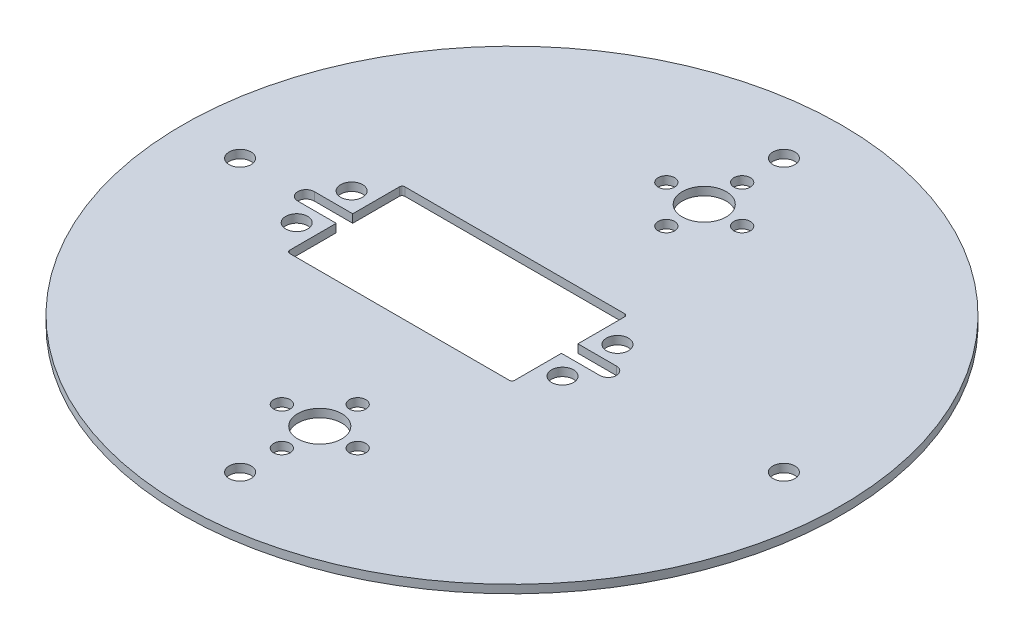
ISO-10303-21;
HEADER;
FILE_DESCRIPTION(('STEP AP214'),'2;1');
FILE_NAME('part.step','',(''),(''),'','','');
FILE_SCHEMA(('AUTOMOTIVE_DESIGN { 1 0 10303 214 1 1 1 1 }'));
ENDSEC;
DATA;
#1=APPLICATION_CONTEXT('core data for automotive mechanical design processes');
#2=APPLICATION_PROTOCOL_DEFINITION('international standard','automotive_design',2000,#1);
#3=PRODUCT_CONTEXT('',#1,'mechanical');
#4=PRODUCT('Part','Part','',(#3));
#5=PRODUCT_RELATED_PRODUCT_CATEGORY('part','',(#4));
#6=PRODUCT_DEFINITION_FORMATION('','',#4);
#7=PRODUCT_DEFINITION_CONTEXT('part definition',#1,'design');
#8=PRODUCT_DEFINITION('design','',#6,#7);
#9=PRODUCT_DEFINITION_SHAPE('','',#8);
#10=(LENGTH_UNIT() NAMED_UNIT(*) SI_UNIT(.MILLI.,.METRE.));
#11=(NAMED_UNIT(*) PLANE_ANGLE_UNIT() SI_UNIT($,.RADIAN.));
#12=(NAMED_UNIT(*) SI_UNIT($,.STERADIAN.) SOLID_ANGLE_UNIT());
#13=UNCERTAINTY_MEASURE_WITH_UNIT(LENGTH_MEASURE(1.E-05),#10,'distance_accuracy_value','');
#14=(GEOMETRIC_REPRESENTATION_CONTEXT(3) GLOBAL_UNCERTAINTY_ASSIGNED_CONTEXT((#13)) GLOBAL_UNIT_ASSIGNED_CONTEXT((#10,
#11,#12)) REPRESENTATION_CONTEXT('',''));
#15=CARTESIAN_POINT('',(0.,0.,0.));
#16=DIRECTION('',(0.,0.,1.));
#17=DIRECTION('',(1.,0.,0.));
#18=AXIS2_PLACEMENT_3D('',#15,#16,#17);
#19=CARTESIAN_POINT('',(0.,1.5,0.));
#20=DIRECTION('',(0.,1.,0.));
#21=DIRECTION('',(0.,0.,1.));
#22=AXIS2_PLACEMENT_3D('',#19,#20,#21);
#23=PLANE('',#22);
#24=CARTESIAN_POINT('',(14.2,1.5,-5.00000000000001));
#25=DIRECTION('',(0.,1.,0.));
#26=DIRECTION('',(0.,0.,-1.));
#27=AXIS2_PLACEMENT_3D('',#24,#25,#26);
#28=CIRCLE('',#27,2.);
#29=CARTESIAN_POINT('',(14.2,1.5,-7.00000000000001));
#30=VERTEX_POINT('',#29);
#31=EDGE_CURVE('E473',#30,#30,#28,.T.);
#32=ORIENTED_EDGE('',*,*,#31,.F.);
#33=EDGE_LOOP('',(#32));
#34=FACE_BOUND('',#33,.T.);
#35=CARTESIAN_POINT('',(-34.2,1.5,-5.));
#36=DIRECTION('',(0.,1.,0.));
#37=DIRECTION('',(0.,0.,1.));
#38=AXIS2_PLACEMENT_3D('',#35,#36,#37);
#39=CIRCLE('',#38,2.);
#40=CARTESIAN_POINT('',(-34.2,1.5,-3.));
#41=VERTEX_POINT('',#40);
#42=EDGE_CURVE('E235',#41,#41,#39,.T.);
#43=ORIENTED_EDGE('',*,*,#42,.F.);
#44=EDGE_LOOP('',(#43));
#45=FACE_BOUND('',#44,.T.);
#46=CARTESIAN_POINT('',(0.,1.5,41.9));
#47=DIRECTION('',(0.,1.,0.));
#48=DIRECTION('',(0.,0.,-1.));
#49=AXIS2_PLACEMENT_3D('',#46,#47,#48);
#50=CIRCLE('',#49,1.5);
#51=CARTESIAN_POINT('',(0.,1.5,40.4));
#52=VERTEX_POINT('',#51);
#53=EDGE_CURVE('E343',#52,#52,#50,.T.);
#54=ORIENTED_EDGE('',*,*,#53,.F.);
#55=EDGE_LOOP('',(#54));
#56=FACE_BOUND('',#55,.T.);
#57=CARTESIAN_POINT('',(1.45918931843151E-13,1.5,28.1));
#58=DIRECTION('',(0.,1.,0.));
#59=DIRECTION('',(0.,0.,-1.));
#60=AXIS2_PLACEMENT_3D('',#57,#58,#59);
#61=CIRCLE('',#60,1.5);
#62=CARTESIAN_POINT('',(1.45918931843151E-13,1.5,26.6));
#63=VERTEX_POINT('',#62);
#64=EDGE_CURVE('E359',#63,#63,#61,.T.);
#65=ORIENTED_EDGE('',*,*,#64,.F.);
#66=EDGE_LOOP('',(#65));
#67=FACE_BOUND('',#66,.T.);
#68=CARTESIAN_POINT('',(1.45918931843151E-13,1.5,-28.1));
#69=DIRECTION('',(0.,1.,0.));
#70=DIRECTION('',(0.,0.,1.));
#71=AXIS2_PLACEMENT_3D('',#68,#69,#70);
#72=CIRCLE('',#71,1.5);
#73=CARTESIAN_POINT('',(1.45918931843151E-13,1.5,-26.6));
#74=VERTEX_POINT('',#73);
#75=EDGE_CURVE('E375',#74,#74,#72,.T.);
#76=ORIENTED_EDGE('',*,*,#75,.F.);
#77=EDGE_LOOP('',(#76));
#78=FACE_BOUND('',#77,.T.);
#79=CARTESIAN_POINT('',(0.,1.5,35.));
#80=DIRECTION('',(0.,1.,0.));
#81=DIRECTION('',(0.,0.,-1.));
#82=AXIS2_PLACEMENT_3D('',#79,#80,#81);
#83=CIRCLE('',#82,4.);
#84=CARTESIAN_POINT('',(0.,1.5,31.));
#85=VERTEX_POINT('',#84);
#86=EDGE_CURVE('E391',#85,#85,#83,.T.);
#87=ORIENTED_EDGE('',*,*,#86,.F.);
#88=EDGE_LOOP('',(#87));
#89=FACE_BOUND('',#88,.T.);
#90=CARTESIAN_POINT('',(0.,1.5,-35.));
#91=DIRECTION('',(0.,1.,0.));
#92=DIRECTION('',(0.,0.,1.));
#93=AXIS2_PLACEMENT_3D('',#90,#91,#92);
#94=CIRCLE('',#93,4.);
#95=CARTESIAN_POINT('',(0.,1.5,-31.));
#96=VERTEX_POINT('',#95);
#97=EDGE_CURVE('E407',#96,#96,#94,.T.);
#98=ORIENTED_EDGE('',*,*,#97,.F.);
#99=EDGE_LOOP('',(#98));
#100=FACE_BOUND('',#99,.T.);
#101=CARTESIAN_POINT('',(0.,1.5,49.5));
#102=DIRECTION('',(0.,1.,0.));
#103=DIRECTION('',(0.,0.,1.));
#104=AXIS2_PLACEMENT_3D('',#101,#102,#103);
#105=CIRCLE('',#104,2.);
#106=CARTESIAN_POINT('',(0.,1.5,51.5));
#107=VERTEX_POINT('',#106);
#108=EDGE_CURVE('E423',#107,#107,#105,.T.);
#109=ORIENTED_EDGE('',*,*,#108,.F.);
#110=EDGE_LOOP('',(#109));
#111=FACE_BOUND('',#110,.T.);
#112=CARTESIAN_POINT('',(0.,1.5,-49.5));
#113=DIRECTION('',(0.,1.,0.));
#114=DIRECTION('',(0.,0.,1.));
#115=AXIS2_PLACEMENT_3D('',#112,#113,#114);
#116=CIRCLE('',#115,2.);
#117=CARTESIAN_POINT('',(0.,1.5,-47.5));
#118=VERTEX_POINT('',#117);
#119=EDGE_CURVE('E439',#118,#118,#116,.T.);
#120=ORIENTED_EDGE('',*,*,#119,.F.);
#121=EDGE_LOOP('',(#120));
#122=FACE_BOUND('',#121,.T.);
#123=CARTESIAN_POINT('',(0.,1.5,0.));
#124=DIRECTION('',(0.,1.,0.));
#125=DIRECTION('',(0.,0.,1.));
#126=AXIS2_PLACEMENT_3D('',#123,#124,#125);
#127=CIRCLE('',#126,60.);
#128=CARTESIAN_POINT('',(0.,1.5,60.));
#129=VERTEX_POINT('',#128);
#130=EDGE_CURVE('E11',#129,#129,#127,.T.);
#131=ORIENTED_EDGE('',*,*,#130,.T.);
#132=EDGE_LOOP('',(#131));
#133=FACE_BOUND('',#132,.T.);
#134=CARTESIAN_POINT('',(-49.5,1.5,0.));
#135=DIRECTION('',(0.,1.,0.));
#136=DIRECTION('',(0.,0.,1.));
#137=AXIS2_PLACEMENT_3D('',#134,#135,#136);
#138=CIRCLE('',#137,2.);
#139=CARTESIAN_POINT('',(-49.5,1.5,2.));
#140=VERTEX_POINT('',#139);
#141=EDGE_CURVE('E431',#140,#140,#138,.T.);
#142=ORIENTED_EDGE('',*,*,#141,.F.);
#143=EDGE_LOOP('',(#142));
#144=FACE_BOUND('',#143,.T.);
#145=CARTESIAN_POINT('',(49.5,1.5,0.));
#146=DIRECTION('',(0.,1.,0.));
#147=DIRECTION('',(0.,0.,1.));
#148=AXIS2_PLACEMENT_3D('',#145,#146,#147);
#149=CIRCLE('',#148,2.);
#150=CARTESIAN_POINT('',(49.5,1.5,2.));
#151=VERTEX_POINT('',#150);
#152=EDGE_CURVE('E415',#151,#151,#149,.T.);
#153=ORIENTED_EDGE('',*,*,#152,.F.);
#154=EDGE_LOOP('',(#153));
#155=FACE_BOUND('',#154,.T.);
#156=CARTESIAN_POINT('',(0.,1.5,-41.9));
#157=DIRECTION('',(0.,1.,0.));
#158=DIRECTION('',(0.,0.,1.));
#159=AXIS2_PLACEMENT_3D('',#156,#157,#158);
#160=CIRCLE('',#159,1.5);
#161=CARTESIAN_POINT('',(0.,1.5,-40.4));
#162=VERTEX_POINT('',#161);
#163=EDGE_CURVE('E399',#162,#162,#160,.T.);
#164=ORIENTED_EDGE('',*,*,#163,.F.);
#165=EDGE_LOOP('',(#164));
#166=FACE_BOUND('',#165,.T.);
#167=CARTESIAN_POINT('',(6.9000000000001,1.5,-35.0000000000001));
#168=DIRECTION('',(0.,1.,0.));
#169=DIRECTION('',(0.,0.,1.));
#170=AXIS2_PLACEMENT_3D('',#167,#168,#169);
#171=CIRCLE('',#170,1.5);
#172=CARTESIAN_POINT('',(6.9000000000001,1.5,-33.5000000000001));
#173=VERTEX_POINT('',#172);
#174=EDGE_CURVE('E383',#173,#173,#171,.T.);
#175=ORIENTED_EDGE('',*,*,#174,.F.);
#176=EDGE_LOOP('',(#175));
#177=FACE_BOUND('',#176,.T.);
#178=CARTESIAN_POINT('',(-6.89999999999991,1.5,-35.));
#179=DIRECTION('',(0.,1.,0.));
#180=DIRECTION('',(0.,0.,1.));
#181=AXIS2_PLACEMENT_3D('',#178,#179,#180);
#182=CIRCLE('',#181,1.50000000000001);
#183=CARTESIAN_POINT('',(-6.89999999999991,1.5,-33.5));
#184=VERTEX_POINT('',#183);
#185=EDGE_CURVE('E367',#184,#184,#182,.T.);
#186=ORIENTED_EDGE('',*,*,#185,.F.);
#187=EDGE_LOOP('',(#186));
#188=FACE_BOUND('',#187,.T.);
#189=CARTESIAN_POINT('',(-6.89999999999991,1.5,35.));
#190=DIRECTION('',(0.,1.,0.));
#191=DIRECTION('',(0.,0.,-1.));
#192=AXIS2_PLACEMENT_3D('',#189,#190,#191);
#193=CIRCLE('',#192,1.50000000000001);
#194=CARTESIAN_POINT('',(-6.89999999999991,1.5,33.5));
#195=VERTEX_POINT('',#194);
#196=EDGE_CURVE('E351',#195,#195,#193,.T.);
#197=ORIENTED_EDGE('',*,*,#196,.F.);
#198=EDGE_LOOP('',(#197));
#199=FACE_BOUND('',#198,.T.);
#200=CARTESIAN_POINT('',(6.9000000000001,1.5,35.0000000000001));
#201=DIRECTION('',(0.,1.,0.));
#202=DIRECTION('',(0.,0.,-1.));
#203=AXIS2_PLACEMENT_3D('',#200,#201,#202);
#204=CIRCLE('',#203,1.5);
#205=CARTESIAN_POINT('',(6.9000000000001,1.5,33.5000000000001));
#206=VERTEX_POINT('',#205);
#207=EDGE_CURVE('E335',#206,#206,#204,.T.);
#208=ORIENTED_EDGE('',*,*,#207,.F.);
#209=EDGE_LOOP('',(#208));
#210=FACE_BOUND('',#209,.T.);
#211=DIRECTION('',(1.,0.,0.));
#212=VECTOR('',#211,1.);
#213=CARTESIAN_POINT('',(-37.5,1.5,1.5));
#214=LINE('',#213,#212);
#215=CARTESIAN_POINT('',(-37.5,1.5,1.5));
#216=VERTEX_POINT('',#215);
#217=CARTESIAN_POINT('',(-30.5,1.5,1.5));
#218=VERTEX_POINT('',#217);
#219=EDGE_CURVE('E172',#216,#218,#214,.T.);
#220=ORIENTED_EDGE('',*,*,#219,.F.);
#221=CARTESIAN_POINT('',(-37.5,1.5,0.));
#222=DIRECTION('',(0.,1.,0.));
#223=DIRECTION('',(0.,0.,1.));
#224=AXIS2_PLACEMENT_3D('',#221,#222,#223);
#225=CIRCLE('',#224,1.5);
#226=CARTESIAN_POINT('',(-37.5,1.5,-1.5));
#227=VERTEX_POINT('',#226);
#228=EDGE_CURVE('E163',#227,#216,#225,.T.);
#229=ORIENTED_EDGE('',*,*,#228,.F.);
#230=DIRECTION('',(-1.,0.,0.));
#231=VECTOR('',#230,1.);
#232=CARTESIAN_POINT('',(-37.5,1.5,-1.5));
#233=LINE('',#232,#231);
#234=CARTESIAN_POINT('',(-30.5,1.5,-1.5));
#235=VERTEX_POINT('',#234);
#236=EDGE_CURVE('E230',#235,#227,#233,.T.);
#237=ORIENTED_EDGE('',*,*,#236,.F.);
#238=DIRECTION('',(0.,0.,1.));
#239=VECTOR('',#238,1.);
#240=CARTESIAN_POINT('',(-30.5,1.5,-1.5));
#241=LINE('',#240,#239);
#242=CARTESIAN_POINT('',(-30.5,1.5,-10.));
#243=VERTEX_POINT('',#242);
#244=EDGE_CURVE('E227',#243,#235,#241,.T.);
#245=ORIENTED_EDGE('',*,*,#244,.F.);
#246=CARTESIAN_POINT('',(-30.,1.5,-10.));
#247=DIRECTION('',(0.,1.,0.));
#248=DIRECTION('',(0.,0.,-1.));
#249=AXIS2_PLACEMENT_3D('',#246,#247,#248);
#250=CIRCLE('',#249,0.5);
#251=CARTESIAN_POINT('',(-30.,1.5,-10.5));
#252=VERTEX_POINT('',#251);
#253=EDGE_CURVE('E224',#252,#243,#250,.T.);
#254=ORIENTED_EDGE('',*,*,#253,.F.);
#255=DIRECTION('',(-1.,0.,0.));
#256=VECTOR('',#255,1.);
#257=CARTESIAN_POINT('',(-30.,1.5,-10.5));
#258=LINE('',#257,#256);
#259=CARTESIAN_POINT('',(10.,1.5,-10.5));
#260=VERTEX_POINT('',#259);
#261=EDGE_CURVE('E221',#260,#252,#258,.T.);
#262=ORIENTED_EDGE('',*,*,#261,.F.);
#263=CARTESIAN_POINT('',(10.,1.5,-10.));
#264=DIRECTION('',(0.,1.,0.));
#265=DIRECTION('',(0.,0.,-1.));
#266=AXIS2_PLACEMENT_3D('',#263,#264,#265);
#267=CIRCLE('',#266,0.5);
#268=CARTESIAN_POINT('',(10.5,1.5,-10.));
#269=VERTEX_POINT('',#268);
#270=EDGE_CURVE('E218',#269,#260,#267,.T.);
#271=ORIENTED_EDGE('',*,*,#270,.F.);
#272=DIRECTION('',(0.,0.,-1.));
#273=VECTOR('',#272,1.);
#274=CARTESIAN_POINT('',(10.5,1.5,-10.));
#275=LINE('',#274,#273);
#276=CARTESIAN_POINT('',(10.5,1.5,-1.5));
#277=VERTEX_POINT('',#276);
#278=EDGE_CURVE('E215',#277,#269,#275,.T.);
#279=ORIENTED_EDGE('',*,*,#278,.F.);
#280=DIRECTION('',(-1.,0.,0.));
#281=VECTOR('',#280,1.);
#282=CARTESIAN_POINT('',(10.5,1.5,-1.5));
#283=LINE('',#282,#281);
#284=CARTESIAN_POINT('',(17.5,1.5,-1.5));
#285=VERTEX_POINT('',#284);
#286=EDGE_CURVE('E212',#285,#277,#283,.T.);
#287=ORIENTED_EDGE('',*,*,#286,.F.);
#288=CARTESIAN_POINT('',(17.5,1.5,0.));
#289=DIRECTION('',(0.,1.,0.));
#290=DIRECTION('',(0.,0.,1.));
#291=AXIS2_PLACEMENT_3D('',#288,#289,#290);
#292=CIRCLE('',#291,1.5);
#293=CARTESIAN_POINT('',(17.5,1.5,1.5));
#294=VERTEX_POINT('',#293);
#295=EDGE_CURVE('E209',#294,#285,#292,.T.);
#296=ORIENTED_EDGE('',*,*,#295,.F.);
#297=DIRECTION('',(1.,0.,0.));
#298=VECTOR('',#297,1.);
#299=CARTESIAN_POINT('',(17.5,1.5,1.5));
#300=LINE('',#299,#298);
#301=CARTESIAN_POINT('',(10.5,1.5,1.5));
#302=VERTEX_POINT('',#301);
#303=EDGE_CURVE('E206',#302,#294,#300,.T.);
#304=ORIENTED_EDGE('',*,*,#303,.F.);
#305=DIRECTION('',(0.,0.,-1.));
#306=VECTOR('',#305,1.);
#307=CARTESIAN_POINT('',(10.5,1.5,1.5));
#308=LINE('',#307,#306);
#309=CARTESIAN_POINT('',(10.5,1.5,9.99999999999999));
#310=VERTEX_POINT('',#309);
#311=EDGE_CURVE('E203',#310,#302,#308,.T.);
#312=ORIENTED_EDGE('',*,*,#311,.F.);
#313=CARTESIAN_POINT('',(10.,1.5,10.));
#314=DIRECTION('',(0.,1.,0.));
#315=DIRECTION('',(0.,0.,-1.));
#316=AXIS2_PLACEMENT_3D('',#313,#314,#315);
#317=CIRCLE('',#316,0.5);
#318=CARTESIAN_POINT('',(10.,1.5,10.5));
#319=VERTEX_POINT('',#318);
#320=EDGE_CURVE('E200',#319,#310,#317,.T.);
#321=ORIENTED_EDGE('',*,*,#320,.F.);
#322=DIRECTION('',(1.,0.,0.));
#323=VECTOR('',#322,1.);
#324=CARTESIAN_POINT('',(10.,1.5,10.5));
#325=LINE('',#324,#323);
#326=CARTESIAN_POINT('',(-30.,1.5,10.5));
#327=VERTEX_POINT('',#326);
#328=EDGE_CURVE('E197',#327,#319,#325,.T.);
#329=ORIENTED_EDGE('',*,*,#328,.F.);
#330=CARTESIAN_POINT('',(-30.,1.5,9.99999999999999));
#331=DIRECTION('',(0.,1.,0.));
#332=DIRECTION('',(0.,0.,-1.));
#333=AXIS2_PLACEMENT_3D('',#330,#331,#332);
#334=CIRCLE('',#333,0.5);
#335=CARTESIAN_POINT('',(-30.5,1.5,9.99999999999999));
#336=VERTEX_POINT('',#335);
#337=EDGE_CURVE('E191',#336,#327,#334,.T.);
#338=ORIENTED_EDGE('',*,*,#337,.F.);
#339=DIRECTION('',(0.,0.,1.));
#340=VECTOR('',#339,1.);
#341=CARTESIAN_POINT('',(-30.5,1.5,9.99999999999999));
#342=LINE('',#341,#340);
#343=EDGE_CURVE('E187',#218,#336,#342,.T.);
#344=ORIENTED_EDGE('',*,*,#343,.F.);
#345=EDGE_LOOP('',(#220,#229,#237,#245,#254,#262,#271,#279,#287,#296,#304,#312,#321,#329,#338,#344));
#346=FACE_BOUND('',#345,.T.);
#347=CARTESIAN_POINT('',(-34.2,1.5,5.));
#348=DIRECTION('',(0.,1.,0.));
#349=DIRECTION('',(0.,0.,-1.));
#350=AXIS2_PLACEMENT_3D('',#347,#348,#349);
#351=CIRCLE('',#350,2.);
#352=CARTESIAN_POINT('',(-34.2,1.5,3.));
#353=VERTEX_POINT('',#352);
#354=EDGE_CURVE('E680',#353,#353,#351,.T.);
#355=ORIENTED_EDGE('',*,*,#354,.F.);
#356=EDGE_LOOP('',(#355));
#357=FACE_BOUND('',#356,.T.);
#358=CARTESIAN_POINT('',(14.2,1.5,5.));
#359=DIRECTION('',(0.,1.,0.));
#360=DIRECTION('',(0.,0.,1.));
#361=AXIS2_PLACEMENT_3D('',#358,#359,#360);
#362=CIRCLE('',#361,2.);
#363=CARTESIAN_POINT('',(14.2,1.5,7.));
#364=VERTEX_POINT('',#363);
#365=EDGE_CURVE('E663',#364,#364,#362,.T.);
#366=ORIENTED_EDGE('',*,*,#365,.F.);
#367=EDGE_LOOP('',(#366));
#368=FACE_BOUND('',#367,.T.);
#369=ADVANCED_FACE('F49',(#34,#45,#56,#67,#78,#89,#100,#111,#122,#133,#144,#155,#166,#177,#188,
#199,#210,#346,#357,#368),#23,.T.);
#370=CARTESIAN_POINT('',(0.,0.,0.));
#371=DIRECTION('',(0.,1.,0.));
#372=DIRECTION('',(0.,0.,1.));
#373=AXIS2_PLACEMENT_3D('',#370,#371,#372);
#374=PLANE('',#373);
#375=CARTESIAN_POINT('',(6.9000000000001,0.,35.0000000000001));
#376=DIRECTION('',(0.,1.,0.));
#377=DIRECTION('',(0.,0.,-1.));
#378=AXIS2_PLACEMENT_3D('',#375,#376,#377);
#379=CIRCLE('',#378,1.5);
#380=CARTESIAN_POINT('',(6.9000000000001,0.,33.5000000000001));
#381=VERTEX_POINT('',#380);
#382=EDGE_CURVE('E181',#381,#381,#379,.T.);
#383=ORIENTED_EDGE('',*,*,#382,.T.);
#384=EDGE_LOOP('',(#383));
#385=FACE_BOUND('',#384,.T.);
#386=CARTESIAN_POINT('',(0.,0.,41.9));
#387=DIRECTION('',(0.,1.,0.));
#388=DIRECTION('',(0.,0.,-1.));
#389=AXIS2_PLACEMENT_3D('',#386,#387,#388);
#390=CIRCLE('',#389,1.5);
#391=CARTESIAN_POINT('',(0.,0.,40.4));
#392=VERTEX_POINT('',#391);
#393=EDGE_CURVE('E339',#392,#392,#390,.T.);
#394=ORIENTED_EDGE('',*,*,#393,.T.);
#395=EDGE_LOOP('',(#394));
#396=FACE_BOUND('',#395,.T.);
#397=CARTESIAN_POINT('',(-6.89999999999991,0.,35.));
#398=DIRECTION('',(0.,1.,0.));
#399=DIRECTION('',(0.,0.,-1.));
#400=AXIS2_PLACEMENT_3D('',#397,#398,#399);
#401=CIRCLE('',#400,1.50000000000001);
#402=CARTESIAN_POINT('',(-6.89999999999991,0.,33.5));
#403=VERTEX_POINT('',#402);
#404=EDGE_CURVE('E347',#403,#403,#401,.T.);
#405=ORIENTED_EDGE('',*,*,#404,.T.);
#406=EDGE_LOOP('',(#405));
#407=FACE_BOUND('',#406,.T.);
#408=CARTESIAN_POINT('',(1.45918931843151E-13,0.,28.1));
#409=DIRECTION('',(0.,1.,0.));
#410=DIRECTION('',(0.,0.,-1.));
#411=AXIS2_PLACEMENT_3D('',#408,#409,#410);
#412=CIRCLE('',#411,1.5);
#413=CARTESIAN_POINT('',(1.45918931843151E-13,0.,26.6));
#414=VERTEX_POINT('',#413);
#415=EDGE_CURVE('E355',#414,#414,#412,.T.);
#416=ORIENTED_EDGE('',*,*,#415,.T.);
#417=EDGE_LOOP('',(#416));
#418=FACE_BOUND('',#417,.T.);
#419=CARTESIAN_POINT('',(-6.89999999999991,0.,-35.));
#420=DIRECTION('',(0.,1.,0.));
#421=DIRECTION('',(0.,0.,1.));
#422=AXIS2_PLACEMENT_3D('',#419,#420,#421);
#423=CIRCLE('',#422,1.50000000000001);
#424=CARTESIAN_POINT('',(-6.89999999999991,0.,-33.5));
#425=VERTEX_POINT('',#424);
#426=EDGE_CURVE('E363',#425,#425,#423,.T.);
#427=ORIENTED_EDGE('',*,*,#426,.T.);
#428=EDGE_LOOP('',(#427));
#429=FACE_BOUND('',#428,.T.);
#430=CARTESIAN_POINT('',(1.45918931843151E-13,0.,-28.1));
#431=DIRECTION('',(0.,1.,0.));
#432=DIRECTION('',(0.,0.,1.));
#433=AXIS2_PLACEMENT_3D('',#430,#431,#432);
#434=CIRCLE('',#433,1.5);
#435=CARTESIAN_POINT('',(1.45918931843151E-13,0.,-26.6));
#436=VERTEX_POINT('',#435);
#437=EDGE_CURVE('E371',#436,#436,#434,.T.);
#438=ORIENTED_EDGE('',*,*,#437,.T.);
#439=EDGE_LOOP('',(#438));
#440=FACE_BOUND('',#439,.T.);
#441=CARTESIAN_POINT('',(6.9000000000001,0.,-35.0000000000001));
#442=DIRECTION('',(0.,1.,0.));
#443=DIRECTION('',(0.,0.,1.));
#444=AXIS2_PLACEMENT_3D('',#441,#442,#443);
#445=CIRCLE('',#444,1.5);
#446=CARTESIAN_POINT('',(6.9000000000001,0.,-33.5000000000001));
#447=VERTEX_POINT('',#446);
#448=EDGE_CURVE('E379',#447,#447,#445,.T.);
#449=ORIENTED_EDGE('',*,*,#448,.T.);
#450=EDGE_LOOP('',(#449));
#451=FACE_BOUND('',#450,.T.);
#452=CARTESIAN_POINT('',(0.,0.,35.));
#453=DIRECTION('',(0.,1.,0.));
#454=DIRECTION('',(0.,0.,-1.));
#455=AXIS2_PLACEMENT_3D('',#452,#453,#454);
#456=CIRCLE('',#455,4.);
#457=CARTESIAN_POINT('',(0.,0.,31.));
#458=VERTEX_POINT('',#457);
#459=EDGE_CURVE('E387',#458,#458,#456,.T.);
#460=ORIENTED_EDGE('',*,*,#459,.T.);
#461=EDGE_LOOP('',(#460));
#462=FACE_BOUND('',#461,.T.);
#463=CARTESIAN_POINT('',(0.,0.,-41.9));
#464=DIRECTION('',(0.,1.,0.));
#465=DIRECTION('',(0.,0.,1.));
#466=AXIS2_PLACEMENT_3D('',#463,#464,#465);
#467=CIRCLE('',#466,1.5);
#468=CARTESIAN_POINT('',(0.,0.,-40.4));
#469=VERTEX_POINT('',#468);
#470=EDGE_CURVE('E395',#469,#469,#467,.T.);
#471=ORIENTED_EDGE('',*,*,#470,.T.);
#472=EDGE_LOOP('',(#471));
#473=FACE_BOUND('',#472,.T.);
#474=CARTESIAN_POINT('',(0.,0.,-35.));
#475=DIRECTION('',(0.,1.,0.));
#476=DIRECTION('',(0.,0.,1.));
#477=AXIS2_PLACEMENT_3D('',#474,#475,#476);
#478=CIRCLE('',#477,4.);
#479=CARTESIAN_POINT('',(0.,0.,-31.));
#480=VERTEX_POINT('',#479);
#481=EDGE_CURVE('E403',#480,#480,#478,.T.);
#482=ORIENTED_EDGE('',*,*,#481,.T.);
#483=EDGE_LOOP('',(#482));
#484=FACE_BOUND('',#483,.T.);
#485=CARTESIAN_POINT('',(49.5,0.,0.));
#486=DIRECTION('',(0.,1.,0.));
#487=DIRECTION('',(0.,0.,1.));
#488=AXIS2_PLACEMENT_3D('',#485,#486,#487);
#489=CIRCLE('',#488,2.);
#490=CARTESIAN_POINT('',(49.5,0.,2.));
#491=VERTEX_POINT('',#490);
#492=EDGE_CURVE('E411',#491,#491,#489,.T.);
#493=ORIENTED_EDGE('',*,*,#492,.T.);
#494=EDGE_LOOP('',(#493));
#495=FACE_BOUND('',#494,.T.);
#496=CARTESIAN_POINT('',(0.,0.,49.5));
#497=DIRECTION('',(0.,1.,0.));
#498=DIRECTION('',(0.,0.,1.));
#499=AXIS2_PLACEMENT_3D('',#496,#497,#498);
#500=CIRCLE('',#499,2.);
#501=CARTESIAN_POINT('',(0.,0.,51.5));
#502=VERTEX_POINT('',#501);
#503=EDGE_CURVE('E419',#502,#502,#500,.T.);
#504=ORIENTED_EDGE('',*,*,#503,.T.);
#505=EDGE_LOOP('',(#504));
#506=FACE_BOUND('',#505,.T.);
#507=CARTESIAN_POINT('',(-49.5,0.,0.));
#508=DIRECTION('',(0.,1.,0.));
#509=DIRECTION('',(0.,0.,1.));
#510=AXIS2_PLACEMENT_3D('',#507,#508,#509);
#511=CIRCLE('',#510,2.);
#512=CARTESIAN_POINT('',(-49.5,0.,2.));
#513=VERTEX_POINT('',#512);
#514=EDGE_CURVE('E427',#513,#513,#511,.T.);
#515=ORIENTED_EDGE('',*,*,#514,.T.);
#516=EDGE_LOOP('',(#515));
#517=FACE_BOUND('',#516,.T.);
#518=CARTESIAN_POINT('',(0.,0.,-49.5));
#519=DIRECTION('',(0.,1.,0.));
#520=DIRECTION('',(0.,0.,1.));
#521=AXIS2_PLACEMENT_3D('',#518,#519,#520);
#522=CIRCLE('',#521,2.);
#523=CARTESIAN_POINT('',(0.,0.,-47.5));
#524=VERTEX_POINT('',#523);
#525=EDGE_CURVE('E435',#524,#524,#522,.T.);
#526=ORIENTED_EDGE('',*,*,#525,.T.);
#527=EDGE_LOOP('',(#526));
#528=FACE_BOUND('',#527,.T.);
#529=CARTESIAN_POINT('',(0.,0.,0.));
#530=DIRECTION('',(0.,1.,0.));
#531=DIRECTION('',(0.,0.,1.));
#532=AXIS2_PLACEMENT_3D('',#529,#530,#531);
#533=CIRCLE('',#532,60.);
#534=CARTESIAN_POINT('',(0.,0.,60.));
#535=VERTEX_POINT('',#534);
#536=EDGE_CURVE('E53',#535,#535,#533,.T.);
#537=ORIENTED_EDGE('',*,*,#536,.F.);
#538=EDGE_LOOP('',(#537));
#539=FACE_BOUND('',#538,.T.);
#540=CARTESIAN_POINT('',(-37.5,0.,0.));
#541=DIRECTION('',(0.,1.,0.));
#542=DIRECTION('',(0.,0.,1.));
#543=AXIS2_PLACEMENT_3D('',#540,#541,#542);
#544=CIRCLE('',#543,1.5);
#545=CARTESIAN_POINT('',(-37.5,0.,-1.5));
#546=VERTEX_POINT('',#545);
#547=CARTESIAN_POINT('',(-37.5,0.,1.5));
#548=VERTEX_POINT('',#547);
#549=EDGE_CURVE('E73',#546,#548,#544,.T.);
#550=ORIENTED_EDGE('',*,*,#549,.T.);
#551=DIRECTION('',(1.,0.,0.));
#552=VECTOR('',#551,1.);
#553=CARTESIAN_POINT('',(-37.5,0.,1.5));
#554=LINE('',#553,#552);
#555=CARTESIAN_POINT('',(-30.5,0.,1.5));
#556=VERTEX_POINT('',#555);
#557=EDGE_CURVE('E179',#548,#556,#554,.T.);
#558=ORIENTED_EDGE('',*,*,#557,.T.);
#559=DIRECTION('',(0.,0.,1.));
#560=VECTOR('',#559,1.);
#561=CARTESIAN_POINT('',(-30.5,0.,9.99999999999999));
#562=LINE('',#561,#560);
#563=CARTESIAN_POINT('',(-30.5,0.,9.99999999999999));
#564=VERTEX_POINT('',#563);
#565=EDGE_CURVE('E238',#556,#564,#562,.T.);
#566=ORIENTED_EDGE('',*,*,#565,.T.);
#567=CARTESIAN_POINT('',(-30.,0.,9.99999999999999));
#568=DIRECTION('',(0.,1.,0.));
#569=DIRECTION('',(0.,0.,-1.));
#570=AXIS2_PLACEMENT_3D('',#567,#568,#569);
#571=CIRCLE('',#570,0.5);
#572=CARTESIAN_POINT('',(-30.,0.,10.5));
#573=VERTEX_POINT('',#572);
#574=EDGE_CURVE('E242',#564,#573,#571,.T.);
#575=ORIENTED_EDGE('',*,*,#574,.T.);
#576=DIRECTION('',(1.,0.,0.));
#577=VECTOR('',#576,1.);
#578=CARTESIAN_POINT('',(10.,0.,10.5));
#579=LINE('',#578,#577);
#580=CARTESIAN_POINT('',(10.,0.,10.5));
#581=VERTEX_POINT('',#580);
#582=EDGE_CURVE('E246',#573,#581,#579,.T.);
#583=ORIENTED_EDGE('',*,*,#582,.T.);
#584=CARTESIAN_POINT('',(10.,0.,10.));
#585=DIRECTION('',(0.,1.,0.));
#586=DIRECTION('',(0.,0.,-1.));
#587=AXIS2_PLACEMENT_3D('',#584,#585,#586);
#588=CIRCLE('',#587,0.5);
#589=CARTESIAN_POINT('',(10.5,0.,9.99999999999999));
#590=VERTEX_POINT('',#589);
#591=EDGE_CURVE('E250',#581,#590,#588,.T.);
#592=ORIENTED_EDGE('',*,*,#591,.T.);
#593=DIRECTION('',(0.,0.,-1.));
#594=VECTOR('',#593,1.);
#595=CARTESIAN_POINT('',(10.5,0.,1.5));
#596=LINE('',#595,#594);
#597=CARTESIAN_POINT('',(10.5,0.,1.5));
#598=VERTEX_POINT('',#597);
#599=EDGE_CURVE('E254',#590,#598,#596,.T.);
#600=ORIENTED_EDGE('',*,*,#599,.T.);
#601=DIRECTION('',(1.,0.,0.));
#602=VECTOR('',#601,1.);
#603=CARTESIAN_POINT('',(17.5,0.,1.5));
#604=LINE('',#603,#602);
#605=CARTESIAN_POINT('',(17.5,0.,1.5));
#606=VERTEX_POINT('',#605);
#607=EDGE_CURVE('E258',#598,#606,#604,.T.);
#608=ORIENTED_EDGE('',*,*,#607,.T.);
#609=CARTESIAN_POINT('',(17.5,0.,0.));
#610=DIRECTION('',(0.,1.,0.));
#611=DIRECTION('',(0.,0.,1.));
#612=AXIS2_PLACEMENT_3D('',#609,#610,#611);
#613=CIRCLE('',#612,1.5);
#614=CARTESIAN_POINT('',(17.5,0.,-1.5));
#615=VERTEX_POINT('',#614);
#616=EDGE_CURVE('E262',#606,#615,#613,.T.);
#617=ORIENTED_EDGE('',*,*,#616,.T.);
#618=DIRECTION('',(-1.,0.,0.));
#619=VECTOR('',#618,1.);
#620=CARTESIAN_POINT('',(10.5,0.,-1.5));
#621=LINE('',#620,#619);
#622=CARTESIAN_POINT('',(10.5,0.,-1.5));
#623=VERTEX_POINT('',#622);
#624=EDGE_CURVE('E266',#615,#623,#621,.T.);
#625=ORIENTED_EDGE('',*,*,#624,.T.);
#626=DIRECTION('',(0.,0.,-1.));
#627=VECTOR('',#626,1.);
#628=CARTESIAN_POINT('',(10.5,0.,-10.));
#629=LINE('',#628,#627);
#630=CARTESIAN_POINT('',(10.5,0.,-10.));
#631=VERTEX_POINT('',#630);
#632=EDGE_CURVE('E270',#623,#631,#629,.T.);
#633=ORIENTED_EDGE('',*,*,#632,.T.);
#634=CARTESIAN_POINT('',(10.,0.,-10.));
#635=DIRECTION('',(0.,1.,0.));
#636=DIRECTION('',(0.,0.,-1.));
#637=AXIS2_PLACEMENT_3D('',#634,#635,#636);
#638=CIRCLE('',#637,0.5);
#639=CARTESIAN_POINT('',(10.,0.,-10.5));
#640=VERTEX_POINT('',#639);
#641=EDGE_CURVE('E274',#631,#640,#638,.T.);
#642=ORIENTED_EDGE('',*,*,#641,.T.);
#643=DIRECTION('',(-1.,0.,0.));
#644=VECTOR('',#643,1.);
#645=CARTESIAN_POINT('',(-30.,0.,-10.5));
#646=LINE('',#645,#644);
#647=CARTESIAN_POINT('',(-30.,0.,-10.5));
#648=VERTEX_POINT('',#647);
#649=EDGE_CURVE('E278',#640,#648,#646,.T.);
#650=ORIENTED_EDGE('',*,*,#649,.T.);
#651=CARTESIAN_POINT('',(-30.,0.,-10.));
#652=DIRECTION('',(0.,1.,0.));
#653=DIRECTION('',(0.,0.,-1.));
#654=AXIS2_PLACEMENT_3D('',#651,#652,#653);
#655=CIRCLE('',#654,0.5);
#656=CARTESIAN_POINT('',(-30.5,0.,-10.));
#657=VERTEX_POINT('',#656);
#658=EDGE_CURVE('E282',#648,#657,#655,.T.);
#659=ORIENTED_EDGE('',*,*,#658,.T.);
#660=DIRECTION('',(0.,0.,1.));
#661=VECTOR('',#660,1.);
#662=CARTESIAN_POINT('',(-30.5,0.,-1.5));
#663=LINE('',#662,#661);
#664=CARTESIAN_POINT('',(-30.5,0.,-1.5));
#665=VERTEX_POINT('',#664);
#666=EDGE_CURVE('E286',#657,#665,#663,.T.);
#667=ORIENTED_EDGE('',*,*,#666,.T.);
#668=DIRECTION('',(-1.,0.,0.));
#669=VECTOR('',#668,1.);
#670=CARTESIAN_POINT('',(-37.5,0.,-1.5));
#671=LINE('',#670,#669);
#672=EDGE_CURVE('E173',#665,#546,#671,.T.);
#673=ORIENTED_EDGE('',*,*,#672,.T.);
#674=EDGE_LOOP('',(#550,#558,#566,#575,#583,#592,#600,#608,#617,#625,#633,#642,#650,#659,#667,#673));
#675=FACE_BOUND('',#674,.T.);
#676=CARTESIAN_POINT('',(-34.2,0.,-5.));
#677=DIRECTION('',(0.,1.,0.));
#678=DIRECTION('',(0.,0.,1.));
#679=AXIS2_PLACEMENT_3D('',#676,#677,#678);
#680=CIRCLE('',#679,2.);
#681=CARTESIAN_POINT('',(-34.2,0.,-3.));
#682=VERTEX_POINT('',#681);
#683=EDGE_CURVE('E684',#682,#682,#680,.T.);
#684=ORIENTED_EDGE('',*,*,#683,.T.);
#685=EDGE_LOOP('',(#684));
#686=FACE_BOUND('',#685,.T.);
#687=CARTESIAN_POINT('',(-34.2,0.,5.));
#688=DIRECTION('',(0.,1.,0.));
#689=DIRECTION('',(0.,0.,-1.));
#690=AXIS2_PLACEMENT_3D('',#687,#688,#689);
#691=CIRCLE('',#690,2.);
#692=CARTESIAN_POINT('',(-34.2,0.,3.));
#693=VERTEX_POINT('',#692);
#694=EDGE_CURVE('E676',#693,#693,#691,.T.);
#695=ORIENTED_EDGE('',*,*,#694,.T.);
#696=EDGE_LOOP('',(#695));
#697=FACE_BOUND('',#696,.T.);
#698=CARTESIAN_POINT('',(14.2,0.,-5.00000000000001));
#699=DIRECTION('',(0.,1.,0.));
#700=DIRECTION('',(0.,0.,-1.));
#701=AXIS2_PLACEMENT_3D('',#698,#699,#700);
#702=CIRCLE('',#701,2.);
#703=CARTESIAN_POINT('',(14.2,0.,-7.00000000000001));
#704=VERTEX_POINT('',#703);
#705=EDGE_CURVE('E671',#704,#704,#702,.T.);
#706=ORIENTED_EDGE('',*,*,#705,.T.);
#707=EDGE_LOOP('',(#706));
#708=FACE_BOUND('',#707,.T.);
#709=CARTESIAN_POINT('',(14.2,0.,5.));
#710=DIRECTION('',(0.,1.,0.));
#711=DIRECTION('',(0.,0.,1.));
#712=AXIS2_PLACEMENT_3D('',#709,#710,#711);
#713=CIRCLE('',#712,2.);
#714=CARTESIAN_POINT('',(14.2,0.,7.));
#715=VERTEX_POINT('',#714);
#716=EDGE_CURVE('E666',#715,#715,#713,.T.);
#717=ORIENTED_EDGE('',*,*,#716,.T.);
#718=EDGE_LOOP('',(#717));
#719=FACE_BOUND('',#718,.T.);
#720=ADVANCED_FACE('F447',(#385,#396,#407,#418,#429,#440,#451,#462,#473,#484,#495,#506,#517,
#528,#539,#675,#686,#697,#708,#719),#374,.F.);
#721=CARTESIAN_POINT('',(0.,1.5,0.));
#722=DIRECTION('',(0.,-1.,0.));
#723=DIRECTION('',(0.,0.,-1.));
#724=AXIS2_PLACEMENT_3D('',#721,#722,#723);
#725=CYLINDRICAL_SURFACE('',#724,60.);
#726=ORIENTED_EDGE('',*,*,#130,.F.);
#727=EDGE_LOOP('',(#726));
#728=FACE_BOUND('',#727,.T.);
#729=ORIENTED_EDGE('',*,*,#536,.T.);
#730=EDGE_LOOP('',(#729));
#731=FACE_BOUND('',#730,.T.);
#732=ADVANCED_FACE('F51',(#728,#731),#725,.T.);
#733=CARTESIAN_POINT('',(0.,1.5,-49.5));
#734=DIRECTION('',(0.,-1.,0.));
#735=DIRECTION('',(0.,0.,-1.));
#736=AXIS2_PLACEMENT_3D('',#733,#734,#735);
#737=CYLINDRICAL_SURFACE('',#736,2.);
#738=ORIENTED_EDGE('',*,*,#119,.T.);
#739=EDGE_LOOP('',(#738));
#740=FACE_BOUND('',#739,.T.);
#741=ORIENTED_EDGE('',*,*,#525,.F.);
#742=EDGE_LOOP('',(#741));
#743=FACE_BOUND('',#742,.T.);
#744=ADVANCED_FACE('F450',(#740,#743),#737,.F.);
#745=CARTESIAN_POINT('',(-49.5,1.5,0.));
#746=DIRECTION('',(0.,-1.,0.));
#747=DIRECTION('',(0.,0.,-1.));
#748=AXIS2_PLACEMENT_3D('',#745,#746,#747);
#749=CYLINDRICAL_SURFACE('',#748,2.);
#750=ORIENTED_EDGE('',*,*,#141,.T.);
#751=EDGE_LOOP('',(#750));
#752=FACE_BOUND('',#751,.T.);
#753=ORIENTED_EDGE('',*,*,#514,.F.);
#754=EDGE_LOOP('',(#753));
#755=FACE_BOUND('',#754,.T.);
#756=ADVANCED_FACE('F452',(#752,#755),#749,.F.);
#757=CARTESIAN_POINT('',(0.,1.5,49.5));
#758=DIRECTION('',(0.,-1.,0.));
#759=DIRECTION('',(0.,0.,-1.));
#760=AXIS2_PLACEMENT_3D('',#757,#758,#759);
#761=CYLINDRICAL_SURFACE('',#760,2.);
#762=ORIENTED_EDGE('',*,*,#108,.T.);
#763=EDGE_LOOP('',(#762));
#764=FACE_BOUND('',#763,.T.);
#765=ORIENTED_EDGE('',*,*,#503,.F.);
#766=EDGE_LOOP('',(#765));
#767=FACE_BOUND('',#766,.T.);
#768=ADVANCED_FACE('F459',(#764,#767),#761,.F.);
#769=CARTESIAN_POINT('',(49.5,1.5,0.));
#770=DIRECTION('',(0.,-1.,0.));
#771=DIRECTION('',(0.,0.,-1.));
#772=AXIS2_PLACEMENT_3D('',#769,#770,#771);
#773=CYLINDRICAL_SURFACE('',#772,2.);
#774=ORIENTED_EDGE('',*,*,#152,.T.);
#775=EDGE_LOOP('',(#774));
#776=FACE_BOUND('',#775,.T.);
#777=ORIENTED_EDGE('',*,*,#492,.F.);
#778=EDGE_LOOP('',(#777));
#779=FACE_BOUND('',#778,.T.);
#780=ADVANCED_FACE('F540',(#776,#779),#773,.F.);
#781=CARTESIAN_POINT('',(0.,1.5,-35.));
#782=DIRECTION('',(0.,-1.,0.));
#783=DIRECTION('',(0.,0.,-1.));
#784=AXIS2_PLACEMENT_3D('',#781,#782,#783);
#785=CYLINDRICAL_SURFACE('',#784,4.);
#786=ORIENTED_EDGE('',*,*,#97,.T.);
#787=EDGE_LOOP('',(#786));
#788=FACE_BOUND('',#787,.T.);
#789=ORIENTED_EDGE('',*,*,#481,.F.);
#790=EDGE_LOOP('',(#789));
#791=FACE_BOUND('',#790,.T.);
#792=ADVANCED_FACE('F546',(#788,#791),#785,.F.);
#793=CARTESIAN_POINT('',(0.,1.5,-41.9));
#794=DIRECTION('',(0.,-1.,0.));
#795=DIRECTION('',(0.,0.,-1.));
#796=AXIS2_PLACEMENT_3D('',#793,#794,#795);
#797=CYLINDRICAL_SURFACE('',#796,1.5);
#798=ORIENTED_EDGE('',*,*,#163,.T.);
#799=EDGE_LOOP('',(#798));
#800=FACE_BOUND('',#799,.T.);
#801=ORIENTED_EDGE('',*,*,#470,.F.);
#802=EDGE_LOOP('',(#801));
#803=FACE_BOUND('',#802,.T.);
#804=ADVANCED_FACE('F552',(#800,#803),#797,.F.);
#805=CARTESIAN_POINT('',(0.,1.5,35.));
#806=DIRECTION('',(0.,-1.,0.));
#807=DIRECTION('',(0.,0.,-1.));
#808=AXIS2_PLACEMENT_3D('',#805,#806,#807);
#809=CYLINDRICAL_SURFACE('',#808,4.);
#810=ORIENTED_EDGE('',*,*,#86,.T.);
#811=EDGE_LOOP('',(#810));
#812=FACE_BOUND('',#811,.T.);
#813=ORIENTED_EDGE('',*,*,#459,.F.);
#814=EDGE_LOOP('',(#813));
#815=FACE_BOUND('',#814,.T.);
#816=ADVANCED_FACE('F556',(#812,#815),#809,.F.);
#817=CARTESIAN_POINT('',(6.9000000000001,1.5,-35.0000000000001));
#818=DIRECTION('',(0.,-1.,0.));
#819=DIRECTION('',(0.,0.,-1.));
#820=AXIS2_PLACEMENT_3D('',#817,#818,#819);
#821=CYLINDRICAL_SURFACE('',#820,1.5);
#822=ORIENTED_EDGE('',*,*,#174,.T.);
#823=EDGE_LOOP('',(#822));
#824=FACE_BOUND('',#823,.T.);
#825=ORIENTED_EDGE('',*,*,#448,.F.);
#826=EDGE_LOOP('',(#825));
#827=FACE_BOUND('',#826,.T.);
#828=ADVANCED_FACE('F560',(#824,#827),#821,.F.);
#829=CARTESIAN_POINT('',(1.45918931843151E-13,1.5,-28.1));
#830=DIRECTION('',(0.,-1.,0.));
#831=DIRECTION('',(0.,0.,-1.));
#832=AXIS2_PLACEMENT_3D('',#829,#830,#831);
#833=CYLINDRICAL_SURFACE('',#832,1.5);
#834=ORIENTED_EDGE('',*,*,#75,.T.);
#835=EDGE_LOOP('',(#834));
#836=FACE_BOUND('',#835,.T.);
#837=ORIENTED_EDGE('',*,*,#437,.F.);
#838=EDGE_LOOP('',(#837));
#839=FACE_BOUND('',#838,.T.);
#840=ADVANCED_FACE('F564',(#836,#839),#833,.F.);
#841=CARTESIAN_POINT('',(-6.89999999999991,1.5,-35.));
#842=DIRECTION('',(0.,-1.,0.));
#843=DIRECTION('',(0.,0.,-1.));
#844=AXIS2_PLACEMENT_3D('',#841,#842,#843);
#845=CYLINDRICAL_SURFACE('',#844,1.50000000000001);
#846=ORIENTED_EDGE('',*,*,#185,.T.);
#847=EDGE_LOOP('',(#846));
#848=FACE_BOUND('',#847,.T.);
#849=ORIENTED_EDGE('',*,*,#426,.F.);
#850=EDGE_LOOP('',(#849));
#851=FACE_BOUND('',#850,.T.);
#852=ADVANCED_FACE('F568',(#848,#851),#845,.F.);
#853=CARTESIAN_POINT('',(1.45918931843151E-13,1.5,28.1));
#854=DIRECTION('',(0.,-1.,0.));
#855=DIRECTION('',(0.,0.,-1.));
#856=AXIS2_PLACEMENT_3D('',#853,#854,#855);
#857=CYLINDRICAL_SURFACE('',#856,1.5);
#858=ORIENTED_EDGE('',*,*,#64,.T.);
#859=EDGE_LOOP('',(#858));
#860=FACE_BOUND('',#859,.T.);
#861=ORIENTED_EDGE('',*,*,#415,.F.);
#862=EDGE_LOOP('',(#861));
#863=FACE_BOUND('',#862,.T.);
#864=ADVANCED_FACE('F572',(#860,#863),#857,.F.);
#865=CARTESIAN_POINT('',(-6.89999999999991,1.5,35.));
#866=DIRECTION('',(0.,-1.,0.));
#867=DIRECTION('',(0.,0.,-1.));
#868=AXIS2_PLACEMENT_3D('',#865,#866,#867);
#869=CYLINDRICAL_SURFACE('',#868,1.50000000000001);
#870=ORIENTED_EDGE('',*,*,#196,.T.);
#871=EDGE_LOOP('',(#870));
#872=FACE_BOUND('',#871,.T.);
#873=ORIENTED_EDGE('',*,*,#404,.F.);
#874=EDGE_LOOP('',(#873));
#875=FACE_BOUND('',#874,.T.);
#876=ADVANCED_FACE('F576',(#872,#875),#869,.F.);
#877=CARTESIAN_POINT('',(0.,1.5,41.9));
#878=DIRECTION('',(0.,-1.,0.));
#879=DIRECTION('',(0.,0.,-1.));
#880=AXIS2_PLACEMENT_3D('',#877,#878,#879);
#881=CYLINDRICAL_SURFACE('',#880,1.5);
#882=ORIENTED_EDGE('',*,*,#53,.T.);
#883=EDGE_LOOP('',(#882));
#884=FACE_BOUND('',#883,.T.);
#885=ORIENTED_EDGE('',*,*,#393,.F.);
#886=EDGE_LOOP('',(#885));
#887=FACE_BOUND('',#886,.T.);
#888=ADVANCED_FACE('F510',(#884,#887),#881,.F.);
#889=CARTESIAN_POINT('',(6.9000000000001,1.5,35.0000000000001));
#890=DIRECTION('',(0.,-1.,0.));
#891=DIRECTION('',(0.,0.,-1.));
#892=AXIS2_PLACEMENT_3D('',#889,#890,#891);
#893=CYLINDRICAL_SURFACE('',#892,1.5);
#894=ORIENTED_EDGE('',*,*,#207,.T.);
#895=EDGE_LOOP('',(#894));
#896=FACE_BOUND('',#895,.T.);
#897=ORIENTED_EDGE('',*,*,#382,.F.);
#898=EDGE_LOOP('',(#897));
#899=FACE_BOUND('',#898,.T.);
#900=ADVANCED_FACE('F507',(#896,#899),#893,.F.);
#901=CARTESIAN_POINT('',(-37.5,1.5,0.));
#902=DIRECTION('',(0.,-1.,0.));
#903=DIRECTION('',(0.,0.,-1.));
#904=AXIS2_PLACEMENT_3D('',#901,#902,#903);
#905=CYLINDRICAL_SURFACE('',#904,1.5);
#906=ORIENTED_EDGE('',*,*,#549,.F.);
#907=DIRECTION('',(0.,-1.,0.));
#908=VECTOR('',#907,1.);
#909=CARTESIAN_POINT('',(-37.5,1.5,-1.5));
#910=LINE('',#909,#908);
#911=EDGE_CURVE('E167',#227,#546,#910,.T.);
#912=ORIENTED_EDGE('',*,*,#911,.F.);
#913=ORIENTED_EDGE('',*,*,#228,.T.);
#914=DIRECTION('',(0.,-1.,0.));
#915=VECTOR('',#914,1.);
#916=CARTESIAN_POINT('',(-37.5,1.5,1.5));
#917=LINE('',#916,#915);
#918=EDGE_CURVE('E166',#216,#548,#917,.T.);
#919=ORIENTED_EDGE('',*,*,#918,.T.);
#920=EDGE_LOOP('',(#906,#912,#913,#919));
#921=FACE_BOUND('',#920,.T.);
#922=ADVANCED_FACE('F165',(#921),#905,.F.);
#923=CARTESIAN_POINT('',(-37.5,1.5,1.5));
#924=DIRECTION('',(0.,0.,-1.));
#925=DIRECTION('',(-1.,0.,0.));
#926=AXIS2_PLACEMENT_3D('',#923,#924,#925);
#927=PLANE('',#926);
#928=ORIENTED_EDGE('',*,*,#557,.F.);
#929=ORIENTED_EDGE('',*,*,#918,.F.);
#930=ORIENTED_EDGE('',*,*,#219,.T.);
#931=DIRECTION('',(0.,-1.,0.));
#932=VECTOR('',#931,1.);
#933=CARTESIAN_POINT('',(-30.5,1.5,1.5));
#934=LINE('',#933,#932);
#935=EDGE_CURVE('E182',#218,#556,#934,.T.);
#936=ORIENTED_EDGE('',*,*,#935,.T.);
#937=EDGE_LOOP('',(#928,#929,#930,#936));
#938=FACE_BOUND('',#937,.T.);
#939=ADVANCED_FACE('F176',(#938),#927,.T.);
#940=CARTESIAN_POINT('',(-30.5,1.5,9.99999999999999));
#941=DIRECTION('',(1.,0.,0.));
#942=DIRECTION('',(0.,0.,-1.));
#943=AXIS2_PLACEMENT_3D('',#940,#941,#942);
#944=PLANE('',#943);
#945=ORIENTED_EDGE('',*,*,#565,.F.);
#946=ORIENTED_EDGE('',*,*,#935,.F.);
#947=ORIENTED_EDGE('',*,*,#343,.T.);
#948=DIRECTION('',(0.,-1.,0.));
#949=VECTOR('',#948,1.);
#950=CARTESIAN_POINT('',(-30.5,1.5,9.99999999999999));
#951=LINE('',#950,#949);
#952=EDGE_CURVE('E330',#336,#564,#951,.T.);
#953=ORIENTED_EDGE('',*,*,#952,.T.);
#954=EDGE_LOOP('',(#945,#946,#947,#953));
#955=FACE_BOUND('',#954,.T.);
#956=ADVANCED_FACE('F588',(#955),#944,.T.);
#957=CARTESIAN_POINT('',(-30.,1.5,9.99999999999999));
#958=DIRECTION('',(0.,-1.,0.));
#959=DIRECTION('',(0.,0.,-1.));
#960=AXIS2_PLACEMENT_3D('',#957,#958,#959);
#961=CYLINDRICAL_SURFACE('',#960,0.5);
#962=ORIENTED_EDGE('',*,*,#574,.F.);
#963=ORIENTED_EDGE('',*,*,#952,.F.);
#964=ORIENTED_EDGE('',*,*,#337,.T.);
#965=DIRECTION('',(0.,-1.,0.));
#966=VECTOR('',#965,1.);
#967=CARTESIAN_POINT('',(-30.,1.5,10.5));
#968=LINE('',#967,#966);
#969=EDGE_CURVE('E327',#327,#573,#968,.T.);
#970=ORIENTED_EDGE('',*,*,#969,.T.);
#971=EDGE_LOOP('',(#962,#963,#964,#970));
#972=FACE_BOUND('',#971,.T.);
#973=ADVANCED_FACE('F591',(#972),#961,.F.);
#974=CARTESIAN_POINT('',(10.,1.5,10.5));
#975=DIRECTION('',(0.,0.,-1.));
#976=DIRECTION('',(-1.,0.,0.));
#977=AXIS2_PLACEMENT_3D('',#974,#975,#976);
#978=PLANE('',#977);
#979=ORIENTED_EDGE('',*,*,#582,.F.);
#980=ORIENTED_EDGE('',*,*,#969,.F.);
#981=ORIENTED_EDGE('',*,*,#328,.T.);
#982=DIRECTION('',(0.,-1.,0.));
#983=VECTOR('',#982,1.);
#984=CARTESIAN_POINT('',(10.,1.5,10.5));
#985=LINE('',#984,#983);
#986=EDGE_CURVE('E324',#319,#581,#985,.T.);
#987=ORIENTED_EDGE('',*,*,#986,.T.);
#988=EDGE_LOOP('',(#979,#980,#981,#987));
#989=FACE_BOUND('',#988,.T.);
#990=ADVANCED_FACE('F595',(#989),#978,.T.);
#991=CARTESIAN_POINT('',(10.,1.5,10.));
#992=DIRECTION('',(0.,-1.,0.));
#993=DIRECTION('',(0.,0.,-1.));
#994=AXIS2_PLACEMENT_3D('',#991,#992,#993);
#995=CYLINDRICAL_SURFACE('',#994,0.5);
#996=ORIENTED_EDGE('',*,*,#591,.F.);
#997=ORIENTED_EDGE('',*,*,#986,.F.);
#998=ORIENTED_EDGE('',*,*,#320,.T.);
#999=DIRECTION('',(0.,-1.,0.));
#1000=VECTOR('',#999,1.);
#1001=CARTESIAN_POINT('',(10.5,1.5,9.99999999999999));
#1002=LINE('',#1001,#1000);
#1003=EDGE_CURVE('E321',#310,#590,#1002,.T.);
#1004=ORIENTED_EDGE('',*,*,#1003,.T.);
#1005=EDGE_LOOP('',(#996,#997,#998,#1004));
#1006=FACE_BOUND('',#1005,.T.);
#1007=ADVANCED_FACE('F599',(#1006),#995,.F.);
#1008=CARTESIAN_POINT('',(10.5,1.5,1.5));
#1009=DIRECTION('',(-1.,0.,0.));
#1010=DIRECTION('',(0.,0.,1.));
#1011=AXIS2_PLACEMENT_3D('',#1008,#1009,#1010);
#1012=PLANE('',#1011);
#1013=ORIENTED_EDGE('',*,*,#599,.F.);
#1014=ORIENTED_EDGE('',*,*,#1003,.F.);
#1015=ORIENTED_EDGE('',*,*,#311,.T.);
#1016=DIRECTION('',(0.,-1.,0.));
#1017=VECTOR('',#1016,1.);
#1018=CARTESIAN_POINT('',(10.5,1.5,1.5));
#1019=LINE('',#1018,#1017);
#1020=EDGE_CURVE('E318',#302,#598,#1019,.T.);
#1021=ORIENTED_EDGE('',*,*,#1020,.T.);
#1022=EDGE_LOOP('',(#1013,#1014,#1015,#1021));
#1023=FACE_BOUND('',#1022,.T.);
#1024=ADVANCED_FACE('F603',(#1023),#1012,.T.);
#1025=CARTESIAN_POINT('',(17.5,1.5,1.5));
#1026=DIRECTION('',(0.,0.,-1.));
#1027=DIRECTION('',(-1.,0.,0.));
#1028=AXIS2_PLACEMENT_3D('',#1025,#1026,#1027);
#1029=PLANE('',#1028);
#1030=ORIENTED_EDGE('',*,*,#607,.F.);
#1031=ORIENTED_EDGE('',*,*,#1020,.F.);
#1032=ORIENTED_EDGE('',*,*,#303,.T.);
#1033=DIRECTION('',(0.,-1.,0.));
#1034=VECTOR('',#1033,1.);
#1035=CARTESIAN_POINT('',(17.5,1.5,1.5));
#1036=LINE('',#1035,#1034);
#1037=EDGE_CURVE('E315',#294,#606,#1036,.T.);
#1038=ORIENTED_EDGE('',*,*,#1037,.T.);
#1039=EDGE_LOOP('',(#1030,#1031,#1032,#1038));
#1040=FACE_BOUND('',#1039,.T.);
#1041=ADVANCED_FACE('F607',(#1040),#1029,.T.);
#1042=CARTESIAN_POINT('',(17.5,1.5,0.));
#1043=DIRECTION('',(0.,-1.,0.));
#1044=DIRECTION('',(0.,0.,-1.));
#1045=AXIS2_PLACEMENT_3D('',#1042,#1043,#1044);
#1046=CYLINDRICAL_SURFACE('',#1045,1.5);
#1047=ORIENTED_EDGE('',*,*,#616,.F.);
#1048=ORIENTED_EDGE('',*,*,#1037,.F.);
#1049=ORIENTED_EDGE('',*,*,#295,.T.);
#1050=DIRECTION('',(0.,-1.,0.));
#1051=VECTOR('',#1050,1.);
#1052=CARTESIAN_POINT('',(17.5,1.5,-1.5));
#1053=LINE('',#1052,#1051);
#1054=EDGE_CURVE('E312',#285,#615,#1053,.T.);
#1055=ORIENTED_EDGE('',*,*,#1054,.T.);
#1056=EDGE_LOOP('',(#1047,#1048,#1049,#1055));
#1057=FACE_BOUND('',#1056,.T.);
#1058=ADVANCED_FACE('F611',(#1057),#1046,.F.);
#1059=CARTESIAN_POINT('',(10.5,1.5,-1.5));
#1060=DIRECTION('',(0.,0.,1.));
#1061=DIRECTION('',(1.,0.,0.));
#1062=AXIS2_PLACEMENT_3D('',#1059,#1060,#1061);
#1063=PLANE('',#1062);
#1064=ORIENTED_EDGE('',*,*,#624,.F.);
#1065=ORIENTED_EDGE('',*,*,#1054,.F.);
#1066=ORIENTED_EDGE('',*,*,#286,.T.);
#1067=DIRECTION('',(0.,-1.,0.));
#1068=VECTOR('',#1067,1.);
#1069=CARTESIAN_POINT('',(10.5,1.5,-1.5));
#1070=LINE('',#1069,#1068);
#1071=EDGE_CURVE('E309',#277,#623,#1070,.T.);
#1072=ORIENTED_EDGE('',*,*,#1071,.T.);
#1073=EDGE_LOOP('',(#1064,#1065,#1066,#1072));
#1074=FACE_BOUND('',#1073,.T.);
#1075=ADVANCED_FACE('F615',(#1074),#1063,.T.);
#1076=CARTESIAN_POINT('',(10.5,1.5,-10.));
#1077=DIRECTION('',(-1.,0.,0.));
#1078=DIRECTION('',(0.,0.,1.));
#1079=AXIS2_PLACEMENT_3D('',#1076,#1077,#1078);
#1080=PLANE('',#1079);
#1081=ORIENTED_EDGE('',*,*,#632,.F.);
#1082=ORIENTED_EDGE('',*,*,#1071,.F.);
#1083=ORIENTED_EDGE('',*,*,#278,.T.);
#1084=DIRECTION('',(0.,-1.,0.));
#1085=VECTOR('',#1084,1.);
#1086=CARTESIAN_POINT('',(10.5,1.5,-10.));
#1087=LINE('',#1086,#1085);
#1088=EDGE_CURVE('E306',#269,#631,#1087,.T.);
#1089=ORIENTED_EDGE('',*,*,#1088,.T.);
#1090=EDGE_LOOP('',(#1081,#1082,#1083,#1089));
#1091=FACE_BOUND('',#1090,.T.);
#1092=ADVANCED_FACE('F619',(#1091),#1080,.T.);
#1093=CARTESIAN_POINT('',(10.,1.5,-10.));
#1094=DIRECTION('',(0.,-1.,0.));
#1095=DIRECTION('',(0.,0.,-1.));
#1096=AXIS2_PLACEMENT_3D('',#1093,#1094,#1095);
#1097=CYLINDRICAL_SURFACE('',#1096,0.5);
#1098=ORIENTED_EDGE('',*,*,#641,.F.);
#1099=ORIENTED_EDGE('',*,*,#1088,.F.);
#1100=ORIENTED_EDGE('',*,*,#270,.T.);
#1101=DIRECTION('',(0.,-1.,0.));
#1102=VECTOR('',#1101,1.);
#1103=CARTESIAN_POINT('',(10.,1.5,-10.5));
#1104=LINE('',#1103,#1102);
#1105=EDGE_CURVE('E303',#260,#640,#1104,.T.);
#1106=ORIENTED_EDGE('',*,*,#1105,.T.);
#1107=EDGE_LOOP('',(#1098,#1099,#1100,#1106));
#1108=FACE_BOUND('',#1107,.T.);
#1109=ADVANCED_FACE('F623',(#1108),#1097,.F.);
#1110=CARTESIAN_POINT('',(-30.,1.5,-10.5));
#1111=DIRECTION('',(0.,0.,1.));
#1112=DIRECTION('',(1.,0.,0.));
#1113=AXIS2_PLACEMENT_3D('',#1110,#1111,#1112);
#1114=PLANE('',#1113);
#1115=ORIENTED_EDGE('',*,*,#649,.F.);
#1116=ORIENTED_EDGE('',*,*,#1105,.F.);
#1117=ORIENTED_EDGE('',*,*,#261,.T.);
#1118=DIRECTION('',(0.,-1.,0.));
#1119=VECTOR('',#1118,1.);
#1120=CARTESIAN_POINT('',(-30.,1.5,-10.5));
#1121=LINE('',#1120,#1119);
#1122=EDGE_CURVE('E300',#252,#648,#1121,.T.);
#1123=ORIENTED_EDGE('',*,*,#1122,.T.);
#1124=EDGE_LOOP('',(#1115,#1116,#1117,#1123));
#1125=FACE_BOUND('',#1124,.T.);
#1126=ADVANCED_FACE('F627',(#1125),#1114,.T.);
#1127=CARTESIAN_POINT('',(-30.,1.5,-10.));
#1128=DIRECTION('',(0.,-1.,0.));
#1129=DIRECTION('',(0.,0.,-1.));
#1130=AXIS2_PLACEMENT_3D('',#1127,#1128,#1129);
#1131=CYLINDRICAL_SURFACE('',#1130,0.5);
#1132=ORIENTED_EDGE('',*,*,#658,.F.);
#1133=ORIENTED_EDGE('',*,*,#1122,.F.);
#1134=ORIENTED_EDGE('',*,*,#253,.T.);
#1135=DIRECTION('',(0.,-1.,0.));
#1136=VECTOR('',#1135,1.);
#1137=CARTESIAN_POINT('',(-30.5,1.5,-10.));
#1138=LINE('',#1137,#1136);
#1139=EDGE_CURVE('E297',#243,#657,#1138,.T.);
#1140=ORIENTED_EDGE('',*,*,#1139,.T.);
#1141=EDGE_LOOP('',(#1132,#1133,#1134,#1140));
#1142=FACE_BOUND('',#1141,.T.);
#1143=ADVANCED_FACE('F631',(#1142),#1131,.F.);
#1144=CARTESIAN_POINT('',(-30.5,1.5,-1.5));
#1145=DIRECTION('',(1.,0.,0.));
#1146=DIRECTION('',(0.,0.,-1.));
#1147=AXIS2_PLACEMENT_3D('',#1144,#1145,#1146);
#1148=PLANE('',#1147);
#1149=ORIENTED_EDGE('',*,*,#666,.F.);
#1150=ORIENTED_EDGE('',*,*,#1139,.F.);
#1151=ORIENTED_EDGE('',*,*,#244,.T.);
#1152=DIRECTION('',(0.,-1.,0.));
#1153=VECTOR('',#1152,1.);
#1154=CARTESIAN_POINT('',(-30.5,1.5,-1.5));
#1155=LINE('',#1154,#1153);
#1156=EDGE_CURVE('E65',#235,#665,#1155,.T.);
#1157=ORIENTED_EDGE('',*,*,#1156,.T.);
#1158=EDGE_LOOP('',(#1149,#1150,#1151,#1157));
#1159=FACE_BOUND('',#1158,.T.);
#1160=ADVANCED_FACE('F635',(#1159),#1148,.T.);
#1161=CARTESIAN_POINT('',(-37.5,1.5,-1.5));
#1162=DIRECTION('',(0.,0.,1.));
#1163=DIRECTION('',(1.,0.,0.));
#1164=AXIS2_PLACEMENT_3D('',#1161,#1162,#1163);
#1165=PLANE('',#1164);
#1166=ORIENTED_EDGE('',*,*,#672,.F.);
#1167=ORIENTED_EDGE('',*,*,#1156,.F.);
#1168=ORIENTED_EDGE('',*,*,#236,.T.);
#1169=ORIENTED_EDGE('',*,*,#911,.T.);
#1170=EDGE_LOOP('',(#1166,#1167,#1168,#1169));
#1171=FACE_BOUND('',#1170,.T.);
#1172=ADVANCED_FACE('F639',(#1171),#1165,.T.);
#1173=CARTESIAN_POINT('',(-34.2,1.5,-5.));
#1174=DIRECTION('',(0.,-1.,0.));
#1175=DIRECTION('',(0.,0.,-1.));
#1176=AXIS2_PLACEMENT_3D('',#1173,#1174,#1175);
#1177=CYLINDRICAL_SURFACE('',#1176,2.);
#1178=ORIENTED_EDGE('',*,*,#42,.T.);
#1179=EDGE_LOOP('',(#1178));
#1180=FACE_BOUND('',#1179,.T.);
#1181=ORIENTED_EDGE('',*,*,#683,.F.);
#1182=EDGE_LOOP('',(#1181));
#1183=FACE_BOUND('',#1182,.T.);
#1184=ADVANCED_FACE('F643',(#1180,#1183),#1177,.F.);
#1185=CARTESIAN_POINT('',(-34.2,1.5,5.));
#1186=DIRECTION('',(0.,-1.,0.));
#1187=DIRECTION('',(0.,0.,-1.));
#1188=AXIS2_PLACEMENT_3D('',#1185,#1186,#1187);
#1189=CYLINDRICAL_SURFACE('',#1188,2.);
#1190=ORIENTED_EDGE('',*,*,#354,.T.);
#1191=EDGE_LOOP('',(#1190));
#1192=FACE_BOUND('',#1191,.T.);
#1193=ORIENTED_EDGE('',*,*,#694,.F.);
#1194=EDGE_LOOP('',(#1193));
#1195=FACE_BOUND('',#1194,.T.);
#1196=ADVANCED_FACE('F646',(#1192,#1195),#1189,.F.);
#1197=CARTESIAN_POINT('',(14.2,1.5,-5.00000000000001));
#1198=DIRECTION('',(0.,-1.,0.));
#1199=DIRECTION('',(0.,0.,-1.));
#1200=AXIS2_PLACEMENT_3D('',#1197,#1198,#1199);
#1201=CYLINDRICAL_SURFACE('',#1200,2.);
#1202=ORIENTED_EDGE('',*,*,#31,.T.);
#1203=EDGE_LOOP('',(#1202));
#1204=FACE_BOUND('',#1203,.T.);
#1205=ORIENTED_EDGE('',*,*,#705,.F.);
#1206=EDGE_LOOP('',(#1205));
#1207=FACE_BOUND('',#1206,.T.);
#1208=ADVANCED_FACE('F650',(#1204,#1207),#1201,.F.);
#1209=CARTESIAN_POINT('',(14.2,1.5,5.));
#1210=DIRECTION('',(0.,-1.,0.));
#1211=DIRECTION('',(0.,0.,-1.));
#1212=AXIS2_PLACEMENT_3D('',#1209,#1210,#1211);
#1213=CYLINDRICAL_SURFACE('',#1212,2.);
#1214=ORIENTED_EDGE('',*,*,#365,.T.);
#1215=EDGE_LOOP('',(#1214));
#1216=FACE_BOUND('',#1215,.T.);
#1217=ORIENTED_EDGE('',*,*,#716,.F.);
#1218=EDGE_LOOP('',(#1217));
#1219=FACE_BOUND('',#1218,.T.);
#1220=ADVANCED_FACE('F654',(#1216,#1219),#1213,.F.);
#1221=CLOSED_SHELL('',(#369,#720,#732,#744,#756,#768,#780,#792,#804,#816,#828,#840,#852,#864,
#876,#888,#900,#922,#939,#956,#973,#990,#1007,#1024,#1041,#1058,#1075,#1092,#1109,#1126,#1143,
#1160,#1172,#1184,#1196,#1208,#1220));
#1222=MANIFOLD_SOLID_BREP('B2',#1221);
#1223=ADVANCED_BREP_SHAPE_REPRESENTATION('',(#18,#1222),#14);
#1224=SHAPE_DEFINITION_REPRESENTATION(#9,#1223);
ENDSEC;
END-ISO-10303-21;
